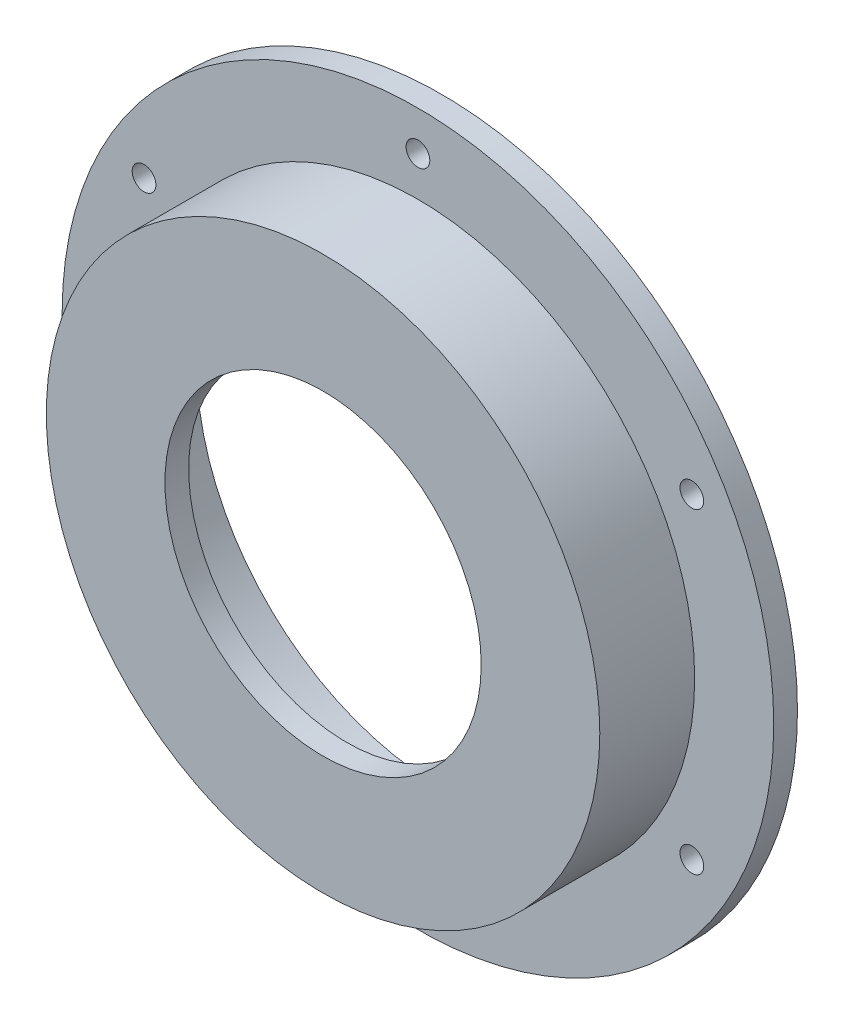
ISO-10303-21;
HEADER;
FILE_DESCRIPTION(('STEP AP214'),'2;1');
FILE_NAME('part.step','',(''),(''),'','','');
FILE_SCHEMA(('AUTOMOTIVE_DESIGN { 1 0 10303 214 1 1 1 1 }'));
ENDSEC;
DATA;
#1=APPLICATION_CONTEXT('core data for automotive mechanical design processes');
#2=APPLICATION_PROTOCOL_DEFINITION('international standard','automotive_design',2000,#1);
#3=PRODUCT_CONTEXT('',#1,'mechanical');
#4=PRODUCT('Part','Part','',(#3));
#5=PRODUCT_RELATED_PRODUCT_CATEGORY('part','',(#4));
#6=PRODUCT_DEFINITION_FORMATION('','',#4);
#7=PRODUCT_DEFINITION_CONTEXT('part definition',#1,'design');
#8=PRODUCT_DEFINITION('design','',#6,#7);
#9=PRODUCT_DEFINITION_SHAPE('','',#8);
#10=(LENGTH_UNIT() NAMED_UNIT(*) SI_UNIT(.MILLI.,.METRE.));
#11=(NAMED_UNIT(*) PLANE_ANGLE_UNIT() SI_UNIT($,.RADIAN.));
#12=(NAMED_UNIT(*) SI_UNIT($,.STERADIAN.) SOLID_ANGLE_UNIT());
#13=UNCERTAINTY_MEASURE_WITH_UNIT(LENGTH_MEASURE(1.E-05),#10,'distance_accuracy_value','');
#14=(GEOMETRIC_REPRESENTATION_CONTEXT(3) GLOBAL_UNCERTAINTY_ASSIGNED_CONTEXT((#13)) GLOBAL_UNIT_ASSIGNED_CONTEXT((#10,
#11,#12)) REPRESENTATION_CONTEXT('',''));
#15=CARTESIAN_POINT('',(0.,0.,0.));
#16=DIRECTION('',(0.,0.,1.));
#17=DIRECTION('',(1.,0.,0.));
#18=AXIS2_PLACEMENT_3D('',#15,#16,#17);
#19=CARTESIAN_POINT('',(0.,0.,0.));
#20=DIRECTION('',(0.,0.,1.));
#21=DIRECTION('',(1.,0.,0.));
#22=AXIS2_PLACEMENT_3D('',#19,#20,#21);
#23=CYLINDRICAL_SURFACE('',#22,31.);
#24=CARTESIAN_POINT('',(0.,0.,0.));
#25=DIRECTION('',(0.,0.,1.));
#26=DIRECTION('',(1.,0.,0.));
#27=AXIS2_PLACEMENT_3D('',#24,#25,#26);
#28=CIRCLE('',#27,31.);
#29=CARTESIAN_POINT('',(31.,0.,0.));
#30=VERTEX_POINT('',#29);
#31=EDGE_CURVE('E67',#30,#30,#28,.T.);
#32=ORIENTED_EDGE('',*,*,#31,.F.);
#33=EDGE_LOOP('',(#32));
#34=FACE_BOUND('',#33,.T.);
#35=CARTESIAN_POINT('',(0.,0.,12.));
#36=DIRECTION('',(0.,0.,1.));
#37=DIRECTION('',(1.,0.,0.));
#38=AXIS2_PLACEMENT_3D('',#35,#36,#37);
#39=CIRCLE('',#38,31.);
#40=CARTESIAN_POINT('',(31.,0.,12.));
#41=VERTEX_POINT('',#40);
#42=EDGE_CURVE('E10',#41,#41,#39,.F.);
#43=ORIENTED_EDGE('',*,*,#42,.F.);
#44=EDGE_LOOP('',(#43));
#45=FACE_BOUND('',#44,.T.);
#46=ADVANCED_FACE('F42',(#34,#45),#23,.F.);
#47=CARTESIAN_POINT('',(0.,0.,3.));
#48=DIRECTION('',(0.,0.,-1.));
#49=DIRECTION('',(-1.,0.,0.));
#50=AXIS2_PLACEMENT_3D('',#47,#48,#49);
#51=CYLINDRICAL_SURFACE('',#50,45.);
#52=CARTESIAN_POINT('',(0.,0.,3.));
#53=DIRECTION('',(0.,0.,1.));
#54=DIRECTION('',(1.,0.,0.));
#55=AXIS2_PLACEMENT_3D('',#52,#53,#54);
#56=CIRCLE('',#55,45.);
#57=CARTESIAN_POINT('',(45.,0.,3.));
#58=VERTEX_POINT('',#57);
#59=EDGE_CURVE('E53',#58,#58,#56,.T.);
#60=ORIENTED_EDGE('',*,*,#59,.F.);
#61=EDGE_LOOP('',(#60));
#62=FACE_BOUND('',#61,.T.);
#63=CARTESIAN_POINT('',(0.,0.,0.));
#64=DIRECTION('',(0.,0.,1.));
#65=DIRECTION('',(1.,0.,0.));
#66=AXIS2_PLACEMENT_3D('',#63,#64,#65);
#67=CIRCLE('',#66,45.);
#68=CARTESIAN_POINT('',(45.,0.,0.));
#69=VERTEX_POINT('',#68);
#70=EDGE_CURVE('E58',#69,#69,#67,.T.);
#71=ORIENTED_EDGE('',*,*,#70,.T.);
#72=EDGE_LOOP('',(#71));
#73=FACE_BOUND('',#72,.T.);
#74=ADVANCED_FACE('F44',(#62,#73),#51,.T.);
#75=CARTESIAN_POINT('',(0.,0.,3.));
#76=DIRECTION('',(0.,0.,1.));
#77=DIRECTION('',(1.,0.,0.));
#78=AXIS2_PLACEMENT_3D('',#75,#76,#77);
#79=PLANE('',#78);
#80=CARTESIAN_POINT('',(0.,40.,3.));
#81=DIRECTION('',(0.,0.,1.));
#82=DIRECTION('',(1.,0.,0.));
#83=AXIS2_PLACEMENT_3D('',#80,#81,#82);
#84=CIRCLE('',#83,1.5);
#85=CARTESIAN_POINT('',(1.5,40.,3.));
#86=VERTEX_POINT('',#85);
#87=EDGE_CURVE('E79',#86,#86,#84,.T.);
#88=ORIENTED_EDGE('',*,*,#87,.F.);
#89=EDGE_LOOP('',(#88));
#90=FACE_BOUND('',#89,.T.);
#91=CARTESIAN_POINT('',(-34.6410161513773,20.0000000000004,3.));
#92=DIRECTION('',(0.,0.,1.));
#93=DIRECTION('',(1.,0.,0.));
#94=AXIS2_PLACEMENT_3D('',#91,#92,#93);
#95=CIRCLE('',#94,1.5);
#96=CARTESIAN_POINT('',(-33.1410161513773,20.0000000000004,3.));
#97=VERTEX_POINT('',#96);
#98=EDGE_CURVE('E83',#97,#97,#95,.T.);
#99=ORIENTED_EDGE('',*,*,#98,.F.);
#100=EDGE_LOOP('',(#99));
#101=FACE_BOUND('',#100,.T.);
#102=CARTESIAN_POINT('',(-34.6410161513777,-19.9999999999997,3.));
#103=DIRECTION('',(0.,0.,1.));
#104=DIRECTION('',(1.,0.,0.));
#105=AXIS2_PLACEMENT_3D('',#102,#103,#104);
#106=CIRCLE('',#105,1.5);
#107=CARTESIAN_POINT('',(-33.1410161513777,-19.9999999999997,3.));
#108=VERTEX_POINT('',#107);
#109=EDGE_CURVE('E86',#108,#108,#106,.T.);
#110=ORIENTED_EDGE('',*,*,#109,.F.);
#111=EDGE_LOOP('',(#110));
#112=FACE_BOUND('',#111,.T.);
#113=CARTESIAN_POINT('',(-2.79318507107451E-13,-40.,3.));
#114=DIRECTION('',(0.,0.,1.));
#115=DIRECTION('',(1.,0.,0.));
#116=AXIS2_PLACEMENT_3D('',#113,#114,#115);
#117=CIRCLE('',#116,1.5);
#118=CARTESIAN_POINT('',(1.49999999999972,-40.,3.));
#119=VERTEX_POINT('',#118);
#120=EDGE_CURVE('E89',#119,#119,#117,.T.);
#121=ORIENTED_EDGE('',*,*,#120,.F.);
#122=EDGE_LOOP('',(#121));
#123=FACE_BOUND('',#122,.T.);
#124=CARTESIAN_POINT('',(34.6410161513775,-20.0000000000002,3.));
#125=DIRECTION('',(0.,0.,1.));
#126=DIRECTION('',(1.,0.,0.));
#127=AXIS2_PLACEMENT_3D('',#124,#125,#126);
#128=CIRCLE('',#127,1.5);
#129=CARTESIAN_POINT('',(36.1410161513775,-20.0000000000002,3.));
#130=VERTEX_POINT('',#129);
#131=EDGE_CURVE('E92',#130,#130,#128,.T.);
#132=ORIENTED_EDGE('',*,*,#131,.F.);
#133=EDGE_LOOP('',(#132));
#134=FACE_BOUND('',#133,.T.);
#135=CARTESIAN_POINT('',(34.6410161513776,19.9999999999999,3.));
#136=DIRECTION('',(0.,0.,1.));
#137=DIRECTION('',(1.,0.,0.));
#138=AXIS2_PLACEMENT_3D('',#135,#136,#137);
#139=CIRCLE('',#138,1.5);
#140=CARTESIAN_POINT('',(36.1410161513776,19.9999999999999,3.));
#141=VERTEX_POINT('',#140);
#142=EDGE_CURVE('E95',#141,#141,#139,.T.);
#143=ORIENTED_EDGE('',*,*,#142,.F.);
#144=EDGE_LOOP('',(#143));
#145=FACE_BOUND('',#144,.T.);
#146=CARTESIAN_POINT('',(0.,0.,3.));
#147=DIRECTION('',(0.,0.,1.));
#148=DIRECTION('',(1.,0.,0.));
#149=AXIS2_PLACEMENT_3D('',#146,#147,#148);
#150=CIRCLE('',#149,35.);
#151=CARTESIAN_POINT('',(35.,0.,3.));
#152=VERTEX_POINT('',#151);
#153=EDGE_CURVE('E49',#152,#152,#150,.T.);
#154=ORIENTED_EDGE('',*,*,#153,.F.);
#155=EDGE_LOOP('',(#154));
#156=FACE_BOUND('',#155,.T.);
#157=ORIENTED_EDGE('',*,*,#59,.T.);
#158=EDGE_LOOP('',(#157));
#159=FACE_BOUND('',#158,.T.);
#160=ADVANCED_FACE('F138',(#90,#101,#112,#123,#134,#145,#156,#159),#79,.T.);
#161=CARTESIAN_POINT('',(0.,0.,0.));
#162=DIRECTION('',(0.,0.,1.));
#163=DIRECTION('',(1.,0.,0.));
#164=AXIS2_PLACEMENT_3D('',#161,#162,#163);
#165=PLANE('',#164);
#166=CARTESIAN_POINT('',(0.,40.,0.));
#167=DIRECTION('',(0.,0.,1.));
#168=DIRECTION('',(1.,0.,0.));
#169=AXIS2_PLACEMENT_3D('',#166,#167,#168);
#170=CIRCLE('',#169,1.5);
#171=CARTESIAN_POINT('',(1.5,40.,0.));
#172=VERTEX_POINT('',#171);
#173=EDGE_CURVE('E98',#172,#172,#170,.T.);
#174=ORIENTED_EDGE('',*,*,#173,.T.);
#175=EDGE_LOOP('',(#174));
#176=FACE_BOUND('',#175,.T.);
#177=CARTESIAN_POINT('',(-34.6410161513773,20.0000000000004,0.));
#178=DIRECTION('',(0.,0.,1.));
#179=DIRECTION('',(1.,0.,0.));
#180=AXIS2_PLACEMENT_3D('',#177,#178,#179);
#181=CIRCLE('',#180,1.5);
#182=CARTESIAN_POINT('',(-33.1410161513773,20.0000000000004,0.));
#183=VERTEX_POINT('',#182);
#184=EDGE_CURVE('E103',#183,#183,#181,.T.);
#185=ORIENTED_EDGE('',*,*,#184,.T.);
#186=EDGE_LOOP('',(#185));
#187=FACE_BOUND('',#186,.T.);
#188=CARTESIAN_POINT('',(-34.6410161513777,-19.9999999999997,0.));
#189=DIRECTION('',(0.,0.,1.));
#190=DIRECTION('',(1.,0.,0.));
#191=AXIS2_PLACEMENT_3D('',#188,#189,#190);
#192=CIRCLE('',#191,1.5);
#193=CARTESIAN_POINT('',(-33.1410161513777,-19.9999999999997,0.));
#194=VERTEX_POINT('',#193);
#195=EDGE_CURVE('E99',#194,#194,#192,.T.);
#196=ORIENTED_EDGE('',*,*,#195,.T.);
#197=EDGE_LOOP('',(#196));
#198=FACE_BOUND('',#197,.T.);
#199=CARTESIAN_POINT('',(-2.79318507107451E-13,-40.,0.));
#200=DIRECTION('',(0.,0.,1.));
#201=DIRECTION('',(1.,0.,0.));
#202=AXIS2_PLACEMENT_3D('',#199,#200,#201);
#203=CIRCLE('',#202,1.5);
#204=CARTESIAN_POINT('',(1.49999999999972,-40.,0.));
#205=VERTEX_POINT('',#204);
#206=EDGE_CURVE('E102',#205,#205,#203,.T.);
#207=ORIENTED_EDGE('',*,*,#206,.T.);
#208=EDGE_LOOP('',(#207));
#209=FACE_BOUND('',#208,.T.);
#210=CARTESIAN_POINT('',(34.6410161513775,-20.0000000000002,0.));
#211=DIRECTION('',(0.,0.,1.));
#212=DIRECTION('',(1.,0.,0.));
#213=AXIS2_PLACEMENT_3D('',#210,#211,#212);
#214=CIRCLE('',#213,1.5);
#215=CARTESIAN_POINT('',(36.1410161513775,-20.0000000000002,0.));
#216=VERTEX_POINT('',#215);
#217=EDGE_CURVE('E106',#216,#216,#214,.T.);
#218=ORIENTED_EDGE('',*,*,#217,.T.);
#219=EDGE_LOOP('',(#218));
#220=FACE_BOUND('',#219,.T.);
#221=CARTESIAN_POINT('',(34.6410161513776,19.9999999999999,0.));
#222=DIRECTION('',(0.,0.,1.));
#223=DIRECTION('',(1.,0.,0.));
#224=AXIS2_PLACEMENT_3D('',#221,#222,#223);
#225=CIRCLE('',#224,1.5);
#226=CARTESIAN_POINT('',(36.1410161513776,19.9999999999999,0.));
#227=VERTEX_POINT('',#226);
#228=EDGE_CURVE('E109',#227,#227,#225,.T.);
#229=ORIENTED_EDGE('',*,*,#228,.T.);
#230=EDGE_LOOP('',(#229));
#231=FACE_BOUND('',#230,.T.);
#232=ORIENTED_EDGE('',*,*,#31,.T.);
#233=EDGE_LOOP('',(#232));
#234=FACE_BOUND('',#233,.T.);
#235=ORIENTED_EDGE('',*,*,#70,.F.);
#236=EDGE_LOOP('',(#235));
#237=FACE_BOUND('',#236,.T.);
#238=ADVANCED_FACE('F117',(#176,#187,#198,#209,#220,#231,#234,#237),#165,.F.);
#239=CARTESIAN_POINT('',(0.,0.,15.));
#240=DIRECTION('',(0.,0.,-1.));
#241=DIRECTION('',(-1.,0.,0.));
#242=AXIS2_PLACEMENT_3D('',#239,#240,#241);
#243=CYLINDRICAL_SURFACE('',#242,35.);
#244=CARTESIAN_POINT('',(0.,0.,15.));
#245=DIRECTION('',(0.,0.,1.));
#246=DIRECTION('',(1.,0.,0.));
#247=AXIS2_PLACEMENT_3D('',#244,#245,#246);
#248=CIRCLE('',#247,35.);
#249=CARTESIAN_POINT('',(35.,0.,15.));
#250=VERTEX_POINT('',#249);
#251=EDGE_CURVE('E61',#250,#250,#248,.T.);
#252=ORIENTED_EDGE('',*,*,#251,.F.);
#253=EDGE_LOOP('',(#252));
#254=FACE_BOUND('',#253,.T.);
#255=ORIENTED_EDGE('',*,*,#153,.T.);
#256=EDGE_LOOP('',(#255));
#257=FACE_BOUND('',#256,.T.);
#258=ADVANCED_FACE('F148',(#254,#257),#243,.T.);
#259=CARTESIAN_POINT('',(0.,0.,15.));
#260=DIRECTION('',(0.,0.,1.));
#261=DIRECTION('',(1.,0.,0.));
#262=AXIS2_PLACEMENT_3D('',#259,#260,#261);
#263=PLANE('',#262);
#264=ORIENTED_EDGE('',*,*,#251,.T.);
#265=EDGE_LOOP('',(#264));
#266=FACE_BOUND('',#265,.T.);
#267=CARTESIAN_POINT('',(0.,0.,15.));
#268=DIRECTION('',(0.,0.,1.));
#269=DIRECTION('',(1.,0.,0.));
#270=AXIS2_PLACEMENT_3D('',#267,#268,#269);
#271=CIRCLE('',#270,20.);
#272=CARTESIAN_POINT('',(20.,0.,15.));
#273=VERTEX_POINT('',#272);
#274=EDGE_CURVE('E75',#273,#273,#271,.T.);
#275=ORIENTED_EDGE('',*,*,#274,.F.);
#276=EDGE_LOOP('',(#275));
#277=FACE_BOUND('',#276,.T.);
#278=ADVANCED_FACE('F145',(#266,#277),#263,.T.);
#279=CARTESIAN_POINT('',(0.,0.,12.));
#280=DIRECTION('',(0.,0.,1.));
#281=DIRECTION('',(1.,0.,0.));
#282=AXIS2_PLACEMENT_3D('',#279,#280,#281);
#283=PLANE('',#282);
#284=CARTESIAN_POINT('',(0.,0.,12.));
#285=DIRECTION('',(0.,0.,1.));
#286=DIRECTION('',(1.,0.,0.));
#287=AXIS2_PLACEMENT_3D('',#284,#285,#286);
#288=CIRCLE('',#287,20.);
#289=CARTESIAN_POINT('',(20.,0.,12.));
#290=VERTEX_POINT('',#289);
#291=EDGE_CURVE('E71',#290,#290,#288,.T.);
#292=ORIENTED_EDGE('',*,*,#291,.T.);
#293=EDGE_LOOP('',(#292));
#294=FACE_BOUND('',#293,.T.);
#295=ORIENTED_EDGE('',*,*,#42,.T.);
#296=EDGE_LOOP('',(#295));
#297=FACE_BOUND('',#296,.T.);
#298=ADVANCED_FACE('F143',(#294,#297),#283,.F.);
#299=CARTESIAN_POINT('',(0.,0.,12.));
#300=DIRECTION('',(0.,0.,1.));
#301=DIRECTION('',(1.,0.,0.));
#302=AXIS2_PLACEMENT_3D('',#299,#300,#301);
#303=CYLINDRICAL_SURFACE('',#302,20.);
#304=ORIENTED_EDGE('',*,*,#291,.F.);
#305=EDGE_LOOP('',(#304));
#306=FACE_BOUND('',#305,.T.);
#307=ORIENTED_EDGE('',*,*,#274,.T.);
#308=EDGE_LOOP('',(#307));
#309=FACE_BOUND('',#308,.T.);
#310=ADVANCED_FACE('F169',(#306,#309),#303,.F.);
#311=CARTESIAN_POINT('',(34.6410161513776,19.9999999999999,0.));
#312=DIRECTION('',(0.,0.,1.));
#313=DIRECTION('',(1.,0.,0.));
#314=AXIS2_PLACEMENT_3D('',#311,#312,#313);
#315=CYLINDRICAL_SURFACE('',#314,1.5);
#316=ORIENTED_EDGE('',*,*,#142,.T.);
#317=EDGE_LOOP('',(#316));
#318=FACE_BOUND('',#317,.T.);
#319=ORIENTED_EDGE('',*,*,#228,.F.);
#320=EDGE_LOOP('',(#319));
#321=FACE_BOUND('',#320,.T.);
#322=ADVANCED_FACE('F164',(#318,#321),#315,.F.);
#323=CARTESIAN_POINT('',(34.6410161513775,-20.0000000000002,0.));
#324=DIRECTION('',(0.,0.,1.));
#325=DIRECTION('',(1.,0.,0.));
#326=AXIS2_PLACEMENT_3D('',#323,#324,#325);
#327=CYLINDRICAL_SURFACE('',#326,1.5);
#328=ORIENTED_EDGE('',*,*,#131,.T.);
#329=EDGE_LOOP('',(#328));
#330=FACE_BOUND('',#329,.T.);
#331=ORIENTED_EDGE('',*,*,#217,.F.);
#332=EDGE_LOOP('',(#331));
#333=FACE_BOUND('',#332,.T.);
#334=ADVANCED_FACE('F168',(#330,#333),#327,.F.);
#335=CARTESIAN_POINT('',(-2.79318507107451E-13,-40.,0.));
#336=DIRECTION('',(0.,0.,1.));
#337=DIRECTION('',(1.,0.,0.));
#338=AXIS2_PLACEMENT_3D('',#335,#336,#337);
#339=CYLINDRICAL_SURFACE('',#338,1.5);
#340=ORIENTED_EDGE('',*,*,#120,.T.);
#341=EDGE_LOOP('',(#340));
#342=FACE_BOUND('',#341,.T.);
#343=ORIENTED_EDGE('',*,*,#206,.F.);
#344=EDGE_LOOP('',(#343));
#345=FACE_BOUND('',#344,.T.);
#346=ADVANCED_FACE('F179',(#342,#345),#339,.F.);
#347=CARTESIAN_POINT('',(-34.6410161513777,-19.9999999999997,0.));
#348=DIRECTION('',(0.,0.,1.));
#349=DIRECTION('',(1.,0.,0.));
#350=AXIS2_PLACEMENT_3D('',#347,#348,#349);
#351=CYLINDRICAL_SURFACE('',#350,1.5);
#352=ORIENTED_EDGE('',*,*,#109,.T.);
#353=EDGE_LOOP('',(#352));
#354=FACE_BOUND('',#353,.T.);
#355=ORIENTED_EDGE('',*,*,#195,.F.);
#356=EDGE_LOOP('',(#355));
#357=FACE_BOUND('',#356,.T.);
#358=ADVANCED_FACE('F128',(#354,#357),#351,.F.);
#359=CARTESIAN_POINT('',(-34.6410161513773,20.0000000000004,0.));
#360=DIRECTION('',(0.,0.,1.));
#361=DIRECTION('',(1.,0.,0.));
#362=AXIS2_PLACEMENT_3D('',#359,#360,#361);
#363=CYLINDRICAL_SURFACE('',#362,1.5);
#364=ORIENTED_EDGE('',*,*,#98,.T.);
#365=EDGE_LOOP('',(#364));
#366=FACE_BOUND('',#365,.T.);
#367=ORIENTED_EDGE('',*,*,#184,.F.);
#368=EDGE_LOOP('',(#367));
#369=FACE_BOUND('',#368,.T.);
#370=ADVANCED_FACE('F122',(#366,#369),#363,.F.);
#371=CARTESIAN_POINT('',(0.,40.,0.));
#372=DIRECTION('',(0.,0.,1.));
#373=DIRECTION('',(1.,0.,0.));
#374=AXIS2_PLACEMENT_3D('',#371,#372,#373);
#375=CYLINDRICAL_SURFACE('',#374,1.5);
#376=ORIENTED_EDGE('',*,*,#87,.T.);
#377=EDGE_LOOP('',(#376));
#378=FACE_BOUND('',#377,.T.);
#379=ORIENTED_EDGE('',*,*,#173,.F.);
#380=EDGE_LOOP('',(#379));
#381=FACE_BOUND('',#380,.T.);
#382=ADVANCED_FACE('F120',(#378,#381),#375,.F.);
#383=CLOSED_SHELL('',(#46,#74,#160,#238,#258,#278,#298,#310,#322,#334,#346,#358,#370,#382));
#384=MANIFOLD_SOLID_BREP('B2',#383);
#385=ADVANCED_BREP_SHAPE_REPRESENTATION('',(#18,#384),#14);
#386=SHAPE_DEFINITION_REPRESENTATION(#9,#385);
ENDSEC;
END-ISO-10303-21;
